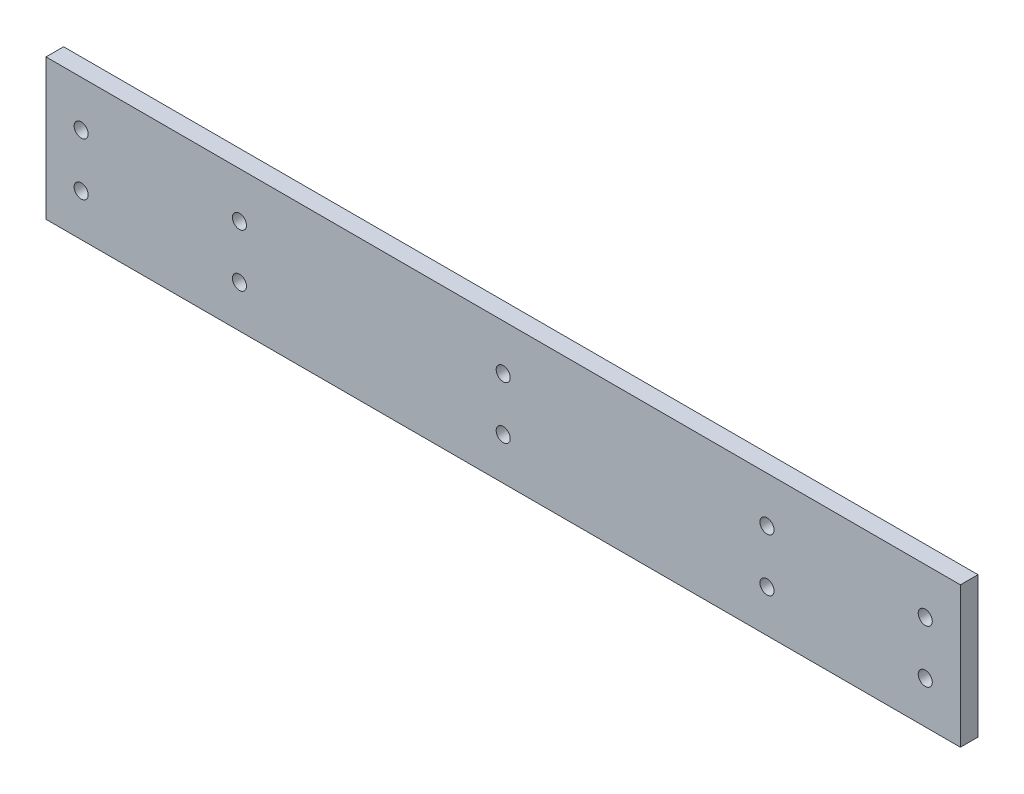
ISO-10303-21;
HEADER;
FILE_DESCRIPTION(('STEP AP214'),'2;1');
FILE_NAME('part.step','',(''),(''),'','','');
FILE_SCHEMA(('AUTOMOTIVE_DESIGN { 1 0 10303 214 1 1 1 1 }'));
ENDSEC;
DATA;
#1=APPLICATION_CONTEXT('core data for automotive mechanical design processes');
#2=APPLICATION_PROTOCOL_DEFINITION('international standard','automotive_design',2000,#1);
#3=PRODUCT_CONTEXT('',#1,'mechanical');
#4=PRODUCT('Part','Part','',(#3));
#5=PRODUCT_RELATED_PRODUCT_CATEGORY('part','',(#4));
#6=PRODUCT_DEFINITION_FORMATION('','',#4);
#7=PRODUCT_DEFINITION_CONTEXT('part definition',#1,'design');
#8=PRODUCT_DEFINITION('design','',#6,#7);
#9=PRODUCT_DEFINITION_SHAPE('','',#8);
#10=(LENGTH_UNIT() NAMED_UNIT(*) SI_UNIT(.MILLI.,.METRE.));
#11=(NAMED_UNIT(*) PLANE_ANGLE_UNIT() SI_UNIT($,.RADIAN.));
#12=(NAMED_UNIT(*) SI_UNIT($,.STERADIAN.) SOLID_ANGLE_UNIT());
#13=UNCERTAINTY_MEASURE_WITH_UNIT(LENGTH_MEASURE(1.E-05),#10,'distance_accuracy_value','');
#14=(GEOMETRIC_REPRESENTATION_CONTEXT(3) GLOBAL_UNCERTAINTY_ASSIGNED_CONTEXT((#13)) GLOBAL_UNIT_ASSIGNED_CONTEXT((#10,
#11,#12)) REPRESENTATION_CONTEXT('',''));
#15=CARTESIAN_POINT('',(0.,0.,0.));
#16=DIRECTION('',(0.,0.,1.));
#17=DIRECTION('',(1.,0.,0.));
#18=AXIS2_PLACEMENT_3D('',#15,#16,#17);
#19=CARTESIAN_POINT('',(0.,0.,5.));
#20=DIRECTION('',(1.,0.,0.));
#21=DIRECTION('',(0.,1.,0.));
#22=AXIS2_PLACEMENT_3D('',#19,#20,#21);
#23=PLANE('',#22);
#24=DIRECTION('',(0.,-1.,0.));
#25=VECTOR('',#24,1.);
#26=CARTESIAN_POINT('',(0.,0.,0.));
#27=LINE('',#26,#25);
#28=CARTESIAN_POINT('',(0.,0.,0.));
#29=VERTEX_POINT('',#28);
#30=CARTESIAN_POINT('',(0.,-40.,0.));
#31=VERTEX_POINT('',#30);
#32=EDGE_CURVE('E96',#29,#31,#27,.T.);
#33=ORIENTED_EDGE('',*,*,#32,.T.);
#34=DIRECTION('',(0.,0.,-1.));
#35=VECTOR('',#34,1.);
#36=CARTESIAN_POINT('',(0.,-40.,5.));
#37=LINE('',#36,#35);
#38=CARTESIAN_POINT('',(0.,-40.,5.));
#39=VERTEX_POINT('',#38);
#40=EDGE_CURVE('E11',#39,#31,#37,.T.);
#41=ORIENTED_EDGE('',*,*,#40,.F.);
#42=DIRECTION('',(0.,-1.,0.));
#43=VECTOR('',#42,1.);
#44=CARTESIAN_POINT('',(0.,0.,5.));
#45=LINE('',#44,#43);
#46=CARTESIAN_POINT('',(0.,0.,5.));
#47=VERTEX_POINT('',#46);
#48=EDGE_CURVE('E84',#47,#39,#45,.T.);
#49=ORIENTED_EDGE('',*,*,#48,.F.);
#50=DIRECTION('',(0.,0.,-1.));
#51=VECTOR('',#50,1.);
#52=CARTESIAN_POINT('',(0.,0.,5.));
#53=LINE('',#52,#51);
#54=EDGE_CURVE('E92',#47,#29,#53,.T.);
#55=ORIENTED_EDGE('',*,*,#54,.T.);
#56=EDGE_LOOP('',(#33,#41,#49,#55));
#57=FACE_BOUND('',#56,.T.);
#58=ADVANCED_FACE('F33',(#57),#23,.F.);
#59=CARTESIAN_POINT('',(0.,-40.,5.));
#60=DIRECTION('',(0.,1.,0.));
#61=DIRECTION('',(0.,0.,1.));
#62=AXIS2_PLACEMENT_3D('',#59,#60,#61);
#63=PLANE('',#62);
#64=DIRECTION('',(1.,0.,0.));
#65=VECTOR('',#64,1.);
#66=CARTESIAN_POINT('',(0.,-40.,0.));
#67=LINE('',#66,#65);
#68=CARTESIAN_POINT('',(260.,-40.,0.));
#69=VERTEX_POINT('',#68);
#70=EDGE_CURVE('E88',#31,#69,#67,.T.);
#71=ORIENTED_EDGE('',*,*,#70,.T.);
#72=DIRECTION('',(0.,0.,-1.));
#73=VECTOR('',#72,1.);
#74=CARTESIAN_POINT('',(260.,-40.,5.));
#75=LINE('',#74,#73);
#76=CARTESIAN_POINT('',(260.,-40.,5.));
#77=VERTEX_POINT('',#76);
#78=EDGE_CURVE('E41',#77,#69,#75,.T.);
#79=ORIENTED_EDGE('',*,*,#78,.F.);
#80=DIRECTION('',(1.,0.,0.));
#81=VECTOR('',#80,1.);
#82=CARTESIAN_POINT('',(0.,-40.,5.));
#83=LINE('',#82,#81);
#84=EDGE_CURVE('E79',#39,#77,#83,.T.);
#85=ORIENTED_EDGE('',*,*,#84,.F.);
#86=ORIENTED_EDGE('',*,*,#40,.T.);
#87=EDGE_LOOP('',(#71,#79,#85,#86));
#88=FACE_BOUND('',#87,.T.);
#89=ADVANCED_FACE('F87',(#88),#63,.F.);
#90=CARTESIAN_POINT('',(260.,0.,5.));
#91=DIRECTION('',(-1.,0.,0.));
#92=DIRECTION('',(0.,0.,1.));
#93=AXIS2_PLACEMENT_3D('',#90,#91,#92);
#94=PLANE('',#93);
#95=DIRECTION('',(0.,1.,0.));
#96=VECTOR('',#95,1.);
#97=CARTESIAN_POINT('',(260.,0.,0.));
#98=LINE('',#97,#96);
#99=CARTESIAN_POINT('',(260.,0.,0.));
#100=VERTEX_POINT('',#99);
#101=EDGE_CURVE('E66',#69,#100,#98,.T.);
#102=ORIENTED_EDGE('',*,*,#101,.T.);
#103=DIRECTION('',(0.,0.,-1.));
#104=VECTOR('',#103,1.);
#105=CARTESIAN_POINT('',(260.,0.,5.));
#106=LINE('',#105,#104);
#107=CARTESIAN_POINT('',(260.,0.,5.));
#108=VERTEX_POINT('',#107);
#109=EDGE_CURVE('E89',#108,#100,#106,.T.);
#110=ORIENTED_EDGE('',*,*,#109,.F.);
#111=DIRECTION('',(0.,1.,0.));
#112=VECTOR('',#111,1.);
#113=CARTESIAN_POINT('',(260.,0.,5.));
#114=LINE('',#113,#112);
#115=EDGE_CURVE('E82',#77,#108,#114,.T.);
#116=ORIENTED_EDGE('',*,*,#115,.F.);
#117=ORIENTED_EDGE('',*,*,#78,.T.);
#118=EDGE_LOOP('',(#102,#110,#116,#117));
#119=FACE_BOUND('',#118,.T.);
#120=ADVANCED_FACE('F90',(#119),#94,.F.);
#121=CARTESIAN_POINT('',(0.,0.,5.));
#122=DIRECTION('',(0.,-1.,0.));
#123=DIRECTION('',(0.,0.,-1.));
#124=AXIS2_PLACEMENT_3D('',#121,#122,#123);
#125=PLANE('',#124);
#126=DIRECTION('',(-1.,0.,0.));
#127=VECTOR('',#126,1.);
#128=CARTESIAN_POINT('',(0.,0.,0.));
#129=LINE('',#128,#127);
#130=EDGE_CURVE('E72',#100,#29,#129,.T.);
#131=ORIENTED_EDGE('',*,*,#130,.T.);
#132=ORIENTED_EDGE('',*,*,#54,.F.);
#133=DIRECTION('',(-1.,0.,0.));
#134=VECTOR('',#133,1.);
#135=CARTESIAN_POINT('',(0.,0.,5.));
#136=LINE('',#135,#134);
#137=EDGE_CURVE('E49',#108,#47,#136,.T.);
#138=ORIENTED_EDGE('',*,*,#137,.F.);
#139=ORIENTED_EDGE('',*,*,#109,.T.);
#140=EDGE_LOOP('',(#131,#132,#138,#139));
#141=FACE_BOUND('',#140,.T.);
#142=ADVANCED_FACE('F104',(#141),#125,.F.);
#143=CARTESIAN_POINT('',(0.,0.,5.));
#144=DIRECTION('',(0.,0.,1.));
#145=DIRECTION('',(1.,0.,0.));
#146=AXIS2_PLACEMENT_3D('',#143,#144,#145);
#147=PLANE('',#146);
#148=CARTESIAN_POINT('',(205.,-13.0000000000003,5.));
#149=DIRECTION('',(0.,0.,1.));
#150=DIRECTION('',(1.,0.,0.));
#151=AXIS2_PLACEMENT_3D('',#148,#149,#150);
#152=CIRCLE('',#151,2.);
#153=CARTESIAN_POINT('',(207.,-13.0000000000003,5.));
#154=VERTEX_POINT('',#153);
#155=EDGE_CURVE('E147',#154,#154,#152,.T.);
#156=ORIENTED_EDGE('',*,*,#155,.F.);
#157=EDGE_LOOP('',(#156));
#158=FACE_BOUND('',#157,.T.);
#159=CARTESIAN_POINT('',(55.,-13.,5.));
#160=DIRECTION('',(0.,0.,1.));
#161=DIRECTION('',(1.,0.,0.));
#162=AXIS2_PLACEMENT_3D('',#159,#160,#161);
#163=CIRCLE('',#162,2.);
#164=CARTESIAN_POINT('',(57.,-13.,5.));
#165=VERTEX_POINT('',#164);
#166=EDGE_CURVE('E140',#165,#165,#163,.T.);
#167=ORIENTED_EDGE('',*,*,#166,.F.);
#168=EDGE_LOOP('',(#167));
#169=FACE_BOUND('',#168,.T.);
#170=CARTESIAN_POINT('',(55.,-28.,5.));
#171=DIRECTION('',(0.,0.,1.));
#172=DIRECTION('',(1.,0.,0.));
#173=AXIS2_PLACEMENT_3D('',#170,#171,#172);
#174=CIRCLE('',#173,2.);
#175=CARTESIAN_POINT('',(57.,-28.,5.));
#176=VERTEX_POINT('',#175);
#177=EDGE_CURVE('E159',#176,#176,#174,.T.);
#178=ORIENTED_EDGE('',*,*,#177,.F.);
#179=EDGE_LOOP('',(#178));
#180=FACE_BOUND('',#179,.T.);
#181=CARTESIAN_POINT('',(130.,-13.,5.));
#182=DIRECTION('',(0.,0.,1.));
#183=DIRECTION('',(1.,0.,0.));
#184=AXIS2_PLACEMENT_3D('',#181,#182,#183);
#185=CIRCLE('',#184,2.);
#186=CARTESIAN_POINT('',(132.,-13.,5.));
#187=VERTEX_POINT('',#186);
#188=EDGE_CURVE('E152',#187,#187,#185,.T.);
#189=ORIENTED_EDGE('',*,*,#188,.F.);
#190=EDGE_LOOP('',(#189));
#191=FACE_BOUND('',#190,.T.);
#192=CARTESIAN_POINT('',(10.,-28.,5.));
#193=DIRECTION('',(0.,0.,1.));
#194=DIRECTION('',(1.,0.,0.));
#195=AXIS2_PLACEMENT_3D('',#192,#193,#194);
#196=CIRCLE('',#195,2.);
#197=CARTESIAN_POINT('',(12.,-28.,5.));
#198=VERTEX_POINT('',#197);
#199=EDGE_CURVE('E123',#198,#198,#196,.T.);
#200=ORIENTED_EDGE('',*,*,#199,.F.);
#201=EDGE_LOOP('',(#200));
#202=FACE_BOUND('',#201,.T.);
#203=CARTESIAN_POINT('',(250.,-28.,5.));
#204=DIRECTION('',(0.,0.,1.));
#205=DIRECTION('',(1.,0.,0.));
#206=AXIS2_PLACEMENT_3D('',#203,#204,#205);
#207=CIRCLE('',#206,2.);
#208=CARTESIAN_POINT('',(252.,-28.,5.));
#209=VERTEX_POINT('',#208);
#210=EDGE_CURVE('E116',#209,#209,#207,.T.);
#211=ORIENTED_EDGE('',*,*,#210,.F.);
#212=EDGE_LOOP('',(#211));
#213=FACE_BOUND('',#212,.T.);
#214=CARTESIAN_POINT('',(250.,-13.,5.));
#215=DIRECTION('',(0.,0.,1.));
#216=DIRECTION('',(1.,0.,0.));
#217=AXIS2_PLACEMENT_3D('',#214,#215,#216);
#218=CIRCLE('',#217,2.);
#219=CARTESIAN_POINT('',(252.,-13.,5.));
#220=VERTEX_POINT('',#219);
#221=EDGE_CURVE('E135',#220,#220,#218,.T.);
#222=ORIENTED_EDGE('',*,*,#221,.F.);
#223=EDGE_LOOP('',(#222));
#224=FACE_BOUND('',#223,.T.);
#225=CARTESIAN_POINT('',(205.,-28.0000000000003,5.));
#226=DIRECTION('',(0.,0.,1.));
#227=DIRECTION('',(1.,0.,0.));
#228=AXIS2_PLACEMENT_3D('',#225,#226,#227);
#229=CIRCLE('',#228,2.);
#230=CARTESIAN_POINT('',(207.,-28.0000000000003,5.));
#231=VERTEX_POINT('',#230);
#232=EDGE_CURVE('E128',#231,#231,#229,.T.);
#233=ORIENTED_EDGE('',*,*,#232,.F.);
#234=EDGE_LOOP('',(#233));
#235=FACE_BOUND('',#234,.T.);
#236=CARTESIAN_POINT('',(130.,-28.,5.));
#237=DIRECTION('',(0.,0.,1.));
#238=DIRECTION('',(1.,0.,0.));
#239=AXIS2_PLACEMENT_3D('',#236,#237,#238);
#240=CIRCLE('',#239,2.);
#241=CARTESIAN_POINT('',(132.,-28.,5.));
#242=VERTEX_POINT('',#241);
#243=EDGE_CURVE('E164',#242,#242,#240,.T.);
#244=ORIENTED_EDGE('',*,*,#243,.F.);
#245=EDGE_LOOP('',(#244));
#246=FACE_BOUND('',#245,.T.);
#247=CARTESIAN_POINT('',(10.,-13.,5.));
#248=DIRECTION('',(0.,0.,1.));
#249=DIRECTION('',(1.,0.,0.));
#250=AXIS2_PLACEMENT_3D('',#247,#248,#249);
#251=CIRCLE('',#250,2.);
#252=CARTESIAN_POINT('',(12.,-13.,5.));
#253=VERTEX_POINT('',#252);
#254=EDGE_CURVE('E110',#253,#253,#251,.T.);
#255=ORIENTED_EDGE('',*,*,#254,.F.);
#256=EDGE_LOOP('',(#255));
#257=FACE_BOUND('',#256,.T.);
#258=ORIENTED_EDGE('',*,*,#48,.T.);
#259=ORIENTED_EDGE('',*,*,#84,.T.);
#260=ORIENTED_EDGE('',*,*,#115,.T.);
#261=ORIENTED_EDGE('',*,*,#137,.T.);
#262=EDGE_LOOP('',(#258,#259,#260,#261));
#263=FACE_BOUND('',#262,.T.);
#264=ADVANCED_FACE('F80',(#158,#169,#180,#191,#202,#213,#224,#235,#246,#257,#263),#147,.T.);
#265=CARTESIAN_POINT('',(0.,0.,0.));
#266=DIRECTION('',(0.,0.,1.));
#267=DIRECTION('',(1.,0.,0.));
#268=AXIS2_PLACEMENT_3D('',#265,#266,#267);
#269=PLANE('',#268);
#270=CARTESIAN_POINT('',(205.,-13.0000000000003,0.));
#271=DIRECTION('',(0.,0.,1.));
#272=DIRECTION('',(1.,0.,0.));
#273=AXIS2_PLACEMENT_3D('',#270,#271,#272);
#274=CIRCLE('',#273,2.);
#275=CARTESIAN_POINT('',(207.,-13.0000000000003,0.));
#276=VERTEX_POINT('',#275);
#277=EDGE_CURVE('E132',#276,#276,#274,.T.);
#278=ORIENTED_EDGE('',*,*,#277,.T.);
#279=EDGE_LOOP('',(#278));
#280=FACE_BOUND('',#279,.T.);
#281=CARTESIAN_POINT('',(55.,-13.,0.));
#282=DIRECTION('',(0.,0.,1.));
#283=DIRECTION('',(1.,0.,0.));
#284=AXIS2_PLACEMENT_3D('',#281,#282,#283);
#285=CIRCLE('',#284,2.);
#286=CARTESIAN_POINT('',(57.,-13.,0.));
#287=VERTEX_POINT('',#286);
#288=EDGE_CURVE('E143',#287,#287,#285,.T.);
#289=ORIENTED_EDGE('',*,*,#288,.T.);
#290=EDGE_LOOP('',(#289));
#291=FACE_BOUND('',#290,.T.);
#292=CARTESIAN_POINT('',(55.,-28.,0.));
#293=DIRECTION('',(0.,0.,1.));
#294=DIRECTION('',(1.,0.,0.));
#295=AXIS2_PLACEMENT_3D('',#292,#293,#294);
#296=CIRCLE('',#295,2.);
#297=CARTESIAN_POINT('',(57.,-28.,0.));
#298=VERTEX_POINT('',#297);
#299=EDGE_CURVE('E144',#298,#298,#296,.T.);
#300=ORIENTED_EDGE('',*,*,#299,.T.);
#301=EDGE_LOOP('',(#300));
#302=FACE_BOUND('',#301,.T.);
#303=CARTESIAN_POINT('',(130.,-13.,0.));
#304=DIRECTION('',(0.,0.,1.));
#305=DIRECTION('',(1.,0.,0.));
#306=AXIS2_PLACEMENT_3D('',#303,#304,#305);
#307=CIRCLE('',#306,2.);
#308=CARTESIAN_POINT('',(132.,-13.,0.));
#309=VERTEX_POINT('',#308);
#310=EDGE_CURVE('E155',#309,#309,#307,.T.);
#311=ORIENTED_EDGE('',*,*,#310,.T.);
#312=EDGE_LOOP('',(#311));
#313=FACE_BOUND('',#312,.T.);
#314=CARTESIAN_POINT('',(10.,-28.,0.));
#315=DIRECTION('',(0.,0.,1.));
#316=DIRECTION('',(1.,0.,0.));
#317=AXIS2_PLACEMENT_3D('',#314,#315,#316);
#318=CIRCLE('',#317,2.);
#319=CARTESIAN_POINT('',(12.,-28.,0.));
#320=VERTEX_POINT('',#319);
#321=EDGE_CURVE('E113',#320,#320,#318,.T.);
#322=ORIENTED_EDGE('',*,*,#321,.T.);
#323=EDGE_LOOP('',(#322));
#324=FACE_BOUND('',#323,.T.);
#325=CARTESIAN_POINT('',(250.,-28.,0.));
#326=DIRECTION('',(0.,0.,1.));
#327=DIRECTION('',(1.,0.,0.));
#328=AXIS2_PLACEMENT_3D('',#325,#326,#327);
#329=CIRCLE('',#328,2.);
#330=CARTESIAN_POINT('',(252.,-28.,0.));
#331=VERTEX_POINT('',#330);
#332=EDGE_CURVE('E119',#331,#331,#329,.T.);
#333=ORIENTED_EDGE('',*,*,#332,.T.);
#334=EDGE_LOOP('',(#333));
#335=FACE_BOUND('',#334,.T.);
#336=CARTESIAN_POINT('',(250.,-13.,0.));
#337=DIRECTION('',(0.,0.,1.));
#338=DIRECTION('',(1.,0.,0.));
#339=AXIS2_PLACEMENT_3D('',#336,#337,#338);
#340=CIRCLE('',#339,2.);
#341=CARTESIAN_POINT('',(252.,-13.,0.));
#342=VERTEX_POINT('',#341);
#343=EDGE_CURVE('E120',#342,#342,#340,.T.);
#344=ORIENTED_EDGE('',*,*,#343,.T.);
#345=EDGE_LOOP('',(#344));
#346=FACE_BOUND('',#345,.T.);
#347=CARTESIAN_POINT('',(205.,-28.0000000000003,0.));
#348=DIRECTION('',(0.,0.,1.));
#349=DIRECTION('',(1.,0.,0.));
#350=AXIS2_PLACEMENT_3D('',#347,#348,#349);
#351=CIRCLE('',#350,2.);
#352=CARTESIAN_POINT('',(207.,-28.0000000000003,0.));
#353=VERTEX_POINT('',#352);
#354=EDGE_CURVE('E131',#353,#353,#351,.T.);
#355=ORIENTED_EDGE('',*,*,#354,.T.);
#356=EDGE_LOOP('',(#355));
#357=FACE_BOUND('',#356,.T.);
#358=CARTESIAN_POINT('',(130.,-28.,0.));
#359=DIRECTION('',(0.,0.,1.));
#360=DIRECTION('',(1.,0.,0.));
#361=AXIS2_PLACEMENT_3D('',#358,#359,#360);
#362=CIRCLE('',#361,2.);
#363=CARTESIAN_POINT('',(132.,-28.,0.));
#364=VERTEX_POINT('',#363);
#365=EDGE_CURVE('E156',#364,#364,#362,.T.);
#366=ORIENTED_EDGE('',*,*,#365,.T.);
#367=EDGE_LOOP('',(#366));
#368=FACE_BOUND('',#367,.T.);
#369=CARTESIAN_POINT('',(10.,-13.,0.));
#370=DIRECTION('',(0.,0.,1.));
#371=DIRECTION('',(1.,0.,0.));
#372=AXIS2_PLACEMENT_3D('',#369,#370,#371);
#373=CIRCLE('',#372,2.);
#374=CARTESIAN_POINT('',(12.,-13.,0.));
#375=VERTEX_POINT('',#374);
#376=EDGE_CURVE('E99',#375,#375,#373,.T.);
#377=ORIENTED_EDGE('',*,*,#376,.T.);
#378=EDGE_LOOP('',(#377));
#379=FACE_BOUND('',#378,.T.);
#380=ORIENTED_EDGE('',*,*,#32,.F.);
#381=ORIENTED_EDGE('',*,*,#130,.F.);
#382=ORIENTED_EDGE('',*,*,#101,.F.);
#383=ORIENTED_EDGE('',*,*,#70,.F.);
#384=EDGE_LOOP('',(#380,#381,#382,#383));
#385=FACE_BOUND('',#384,.T.);
#386=ADVANCED_FACE('F107',(#280,#291,#302,#313,#324,#335,#346,#357,#368,#379,#385),#269,.F.);
#387=CARTESIAN_POINT('',(10.,-13.,0.));
#388=DIRECTION('',(0.,0.,1.));
#389=DIRECTION('',(1.,0.,0.));
#390=AXIS2_PLACEMENT_3D('',#387,#388,#389);
#391=CYLINDRICAL_SURFACE('',#390,2.);
#392=ORIENTED_EDGE('',*,*,#376,.F.);
#393=EDGE_LOOP('',(#392));
#394=FACE_BOUND('',#393,.T.);
#395=ORIENTED_EDGE('',*,*,#254,.T.);
#396=EDGE_LOOP('',(#395));
#397=FACE_BOUND('',#396,.T.);
#398=ADVANCED_FACE('F176',(#394,#397),#391,.F.);
#399=CARTESIAN_POINT('',(130.,-28.,0.));
#400=DIRECTION('',(0.,0.,1.));
#401=DIRECTION('',(1.,0.,0.));
#402=AXIS2_PLACEMENT_3D('',#399,#400,#401);
#403=CYLINDRICAL_SURFACE('',#402,2.);
#404=ORIENTED_EDGE('',*,*,#365,.F.);
#405=EDGE_LOOP('',(#404));
#406=FACE_BOUND('',#405,.T.);
#407=ORIENTED_EDGE('',*,*,#243,.T.);
#408=EDGE_LOOP('',(#407));
#409=FACE_BOUND('',#408,.T.);
#410=ADVANCED_FACE('F172',(#406,#409),#403,.F.);
#411=CARTESIAN_POINT('',(205.,-28.0000000000003,0.));
#412=DIRECTION('',(0.,0.,1.));
#413=DIRECTION('',(1.,0.,0.));
#414=AXIS2_PLACEMENT_3D('',#411,#412,#413);
#415=CYLINDRICAL_SURFACE('',#414,2.);
#416=ORIENTED_EDGE('',*,*,#354,.F.);
#417=EDGE_LOOP('',(#416));
#418=FACE_BOUND('',#417,.T.);
#419=ORIENTED_EDGE('',*,*,#232,.T.);
#420=EDGE_LOOP('',(#419));
#421=FACE_BOUND('',#420,.T.);
#422=ADVANCED_FACE('F175',(#418,#421),#415,.F.);
#423=CARTESIAN_POINT('',(250.,-13.,0.));
#424=DIRECTION('',(0.,0.,1.));
#425=DIRECTION('',(1.,0.,0.));
#426=AXIS2_PLACEMENT_3D('',#423,#424,#425);
#427=CYLINDRICAL_SURFACE('',#426,2.);
#428=ORIENTED_EDGE('',*,*,#343,.F.);
#429=EDGE_LOOP('',(#428));
#430=FACE_BOUND('',#429,.T.);
#431=ORIENTED_EDGE('',*,*,#221,.T.);
#432=EDGE_LOOP('',(#431));
#433=FACE_BOUND('',#432,.T.);
#434=ADVANCED_FACE('F237',(#430,#433),#427,.F.);
#435=CARTESIAN_POINT('',(250.,-28.,0.));
#436=DIRECTION('',(0.,0.,1.));
#437=DIRECTION('',(1.,0.,0.));
#438=AXIS2_PLACEMENT_3D('',#435,#436,#437);
#439=CYLINDRICAL_SURFACE('',#438,2.);
#440=ORIENTED_EDGE('',*,*,#332,.F.);
#441=EDGE_LOOP('',(#440));
#442=FACE_BOUND('',#441,.T.);
#443=ORIENTED_EDGE('',*,*,#210,.T.);
#444=EDGE_LOOP('',(#443));
#445=FACE_BOUND('',#444,.T.);
#446=ADVANCED_FACE('F247',(#442,#445),#439,.F.);
#447=CARTESIAN_POINT('',(10.,-28.,0.));
#448=DIRECTION('',(0.,0.,1.));
#449=DIRECTION('',(1.,0.,0.));
#450=AXIS2_PLACEMENT_3D('',#447,#448,#449);
#451=CYLINDRICAL_SURFACE('',#450,2.);
#452=ORIENTED_EDGE('',*,*,#321,.F.);
#453=EDGE_LOOP('',(#452));
#454=FACE_BOUND('',#453,.T.);
#455=ORIENTED_EDGE('',*,*,#199,.T.);
#456=EDGE_LOOP('',(#455));
#457=FACE_BOUND('',#456,.T.);
#458=ADVANCED_FACE('F257',(#454,#457),#451,.F.);
#459=CARTESIAN_POINT('',(130.,-13.,0.));
#460=DIRECTION('',(0.,0.,1.));
#461=DIRECTION('',(1.,0.,0.));
#462=AXIS2_PLACEMENT_3D('',#459,#460,#461);
#463=CYLINDRICAL_SURFACE('',#462,2.);
#464=ORIENTED_EDGE('',*,*,#310,.F.);
#465=EDGE_LOOP('',(#464));
#466=FACE_BOUND('',#465,.T.);
#467=ORIENTED_EDGE('',*,*,#188,.T.);
#468=EDGE_LOOP('',(#467));
#469=FACE_BOUND('',#468,.T.);
#470=ADVANCED_FACE('F266',(#466,#469),#463,.F.);
#471=CARTESIAN_POINT('',(55.,-28.,0.));
#472=DIRECTION('',(0.,0.,1.));
#473=DIRECTION('',(1.,0.,0.));
#474=AXIS2_PLACEMENT_3D('',#471,#472,#473);
#475=CYLINDRICAL_SURFACE('',#474,2.);
#476=ORIENTED_EDGE('',*,*,#299,.F.);
#477=EDGE_LOOP('',(#476));
#478=FACE_BOUND('',#477,.T.);
#479=ORIENTED_EDGE('',*,*,#177,.T.);
#480=EDGE_LOOP('',(#479));
#481=FACE_BOUND('',#480,.T.);
#482=ADVANCED_FACE('F276',(#478,#481),#475,.F.);
#483=CARTESIAN_POINT('',(55.,-13.,0.));
#484=DIRECTION('',(0.,0.,1.));
#485=DIRECTION('',(1.,0.,0.));
#486=AXIS2_PLACEMENT_3D('',#483,#484,#485);
#487=CYLINDRICAL_SURFACE('',#486,2.);
#488=ORIENTED_EDGE('',*,*,#288,.F.);
#489=EDGE_LOOP('',(#488));
#490=FACE_BOUND('',#489,.T.);
#491=ORIENTED_EDGE('',*,*,#166,.T.);
#492=EDGE_LOOP('',(#491));
#493=FACE_BOUND('',#492,.T.);
#494=ADVANCED_FACE('F286',(#490,#493),#487,.F.);
#495=CARTESIAN_POINT('',(205.,-13.0000000000003,0.));
#496=DIRECTION('',(0.,0.,1.));
#497=DIRECTION('',(1.,0.,0.));
#498=AXIS2_PLACEMENT_3D('',#495,#496,#497);
#499=CYLINDRICAL_SURFACE('',#498,2.);
#500=ORIENTED_EDGE('',*,*,#277,.F.);
#501=EDGE_LOOP('',(#500));
#502=FACE_BOUND('',#501,.T.);
#503=ORIENTED_EDGE('',*,*,#155,.T.);
#504=EDGE_LOOP('',(#503));
#505=FACE_BOUND('',#504,.T.);
#506=ADVANCED_FACE('F296',(#502,#505),#499,.F.);
#507=CLOSED_SHELL('',(#58,#89,#120,#142,#264,#386,#398,#410,#422,#434,#446,#458,#470,#482,#494,#506));
#508=MANIFOLD_SOLID_BREP('B2',#507);
#509=ADVANCED_BREP_SHAPE_REPRESENTATION('',(#18,#508),#14);
#510=SHAPE_DEFINITION_REPRESENTATION(#9,#509);
ENDSEC;
END-ISO-10303-21;
